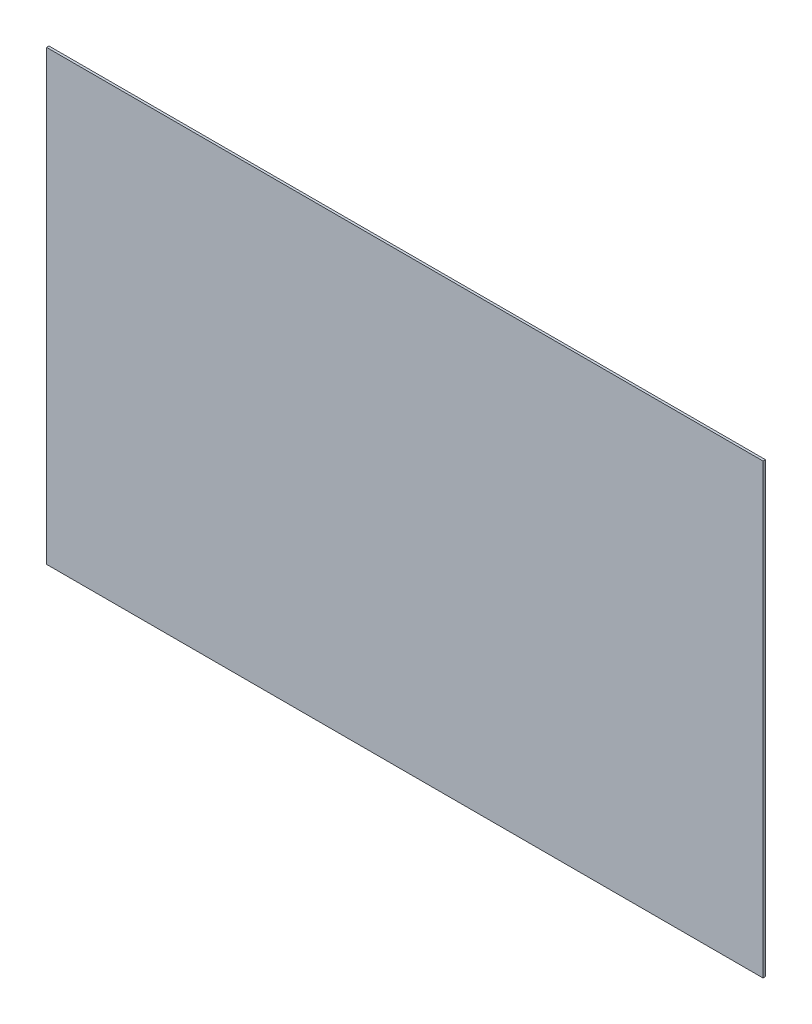
ISO-10303-21;
HEADER;
FILE_DESCRIPTION(('STEP AP214'),'2;1');
FILE_NAME('part.step','',(''),(''),'','','');
FILE_SCHEMA(('AUTOMOTIVE_DESIGN { 1 0 10303 214 1 1 1 1 }'));
ENDSEC;
DATA;
#1=APPLICATION_CONTEXT('core data for automotive mechanical design processes');
#2=APPLICATION_PROTOCOL_DEFINITION('international standard','automotive_design',2000,#1);
#3=PRODUCT_CONTEXT('',#1,'mechanical');
#4=PRODUCT('Part','Part','',(#3));
#5=PRODUCT_RELATED_PRODUCT_CATEGORY('part','',(#4));
#6=PRODUCT_DEFINITION_FORMATION('','',#4);
#7=PRODUCT_DEFINITION_CONTEXT('part definition',#1,'design');
#8=PRODUCT_DEFINITION('design','',#6,#7);
#9=PRODUCT_DEFINITION_SHAPE('','',#8);
#10=(LENGTH_UNIT() NAMED_UNIT(*) SI_UNIT(.MILLI.,.METRE.));
#11=(NAMED_UNIT(*) PLANE_ANGLE_UNIT() SI_UNIT($,.RADIAN.));
#12=(NAMED_UNIT(*) SI_UNIT($,.STERADIAN.) SOLID_ANGLE_UNIT());
#13=UNCERTAINTY_MEASURE_WITH_UNIT(LENGTH_MEASURE(1.E-05),#10,'distance_accuracy_value','');
#14=(GEOMETRIC_REPRESENTATION_CONTEXT(3) GLOBAL_UNCERTAINTY_ASSIGNED_CONTEXT((#13)) GLOBAL_UNIT_ASSIGNED_CONTEXT((#10,
#11,#12)) REPRESENTATION_CONTEXT('',''));
#15=CARTESIAN_POINT('',(0.,0.,0.));
#16=DIRECTION('',(0.,0.,1.));
#17=DIRECTION('',(1.,0.,0.));
#18=AXIS2_PLACEMENT_3D('',#15,#16,#17);
#19=CARTESIAN_POINT('',(0.,1200.00666664815,0.));
#20=DIRECTION('',(-1.,0.,0.));
#21=DIRECTION('',(0.,0.,1.));
#22=AXIS2_PLACEMENT_3D('',#19,#20,#21);
#23=PLANE('',#22);
#24=DIRECTION('',(0.,0.,-1.));
#25=VECTOR('',#24,1.);
#26=CARTESIAN_POINT('',(0.,0.,0.));
#27=LINE('',#26,#25);
#28=CARTESIAN_POINT('',(0.,0.,0.));
#29=VERTEX_POINT('',#28);
#30=CARTESIAN_POINT('',(0.,4.44089209850063E-13,-4.));
#31=VERTEX_POINT('',#30);
#32=EDGE_CURVE('E84',#29,#31,#27,.T.);
#33=ORIENTED_EDGE('',*,*,#32,.F.);
#34=DIRECTION('',(0.,-1.,0.));
#35=VECTOR('',#34,1.);
#36=CARTESIAN_POINT('',(0.,1200.00666664815,0.));
#37=LINE('',#36,#35);
#38=CARTESIAN_POINT('',(0.,-750.,0.));
#39=VERTEX_POINT('',#38);
#40=EDGE_CURVE('E38',#29,#39,#37,.T.);
#41=ORIENTED_EDGE('',*,*,#40,.T.);
#42=DIRECTION('',(0.,0.,-1.));
#43=VECTOR('',#42,1.);
#44=CARTESIAN_POINT('',(0.,-750.,0.));
#45=LINE('',#44,#43);
#46=CARTESIAN_POINT('',(0.,-750.,-4.));
#47=VERTEX_POINT('',#46);
#48=EDGE_CURVE('E82',#39,#47,#45,.T.);
#49=ORIENTED_EDGE('',*,*,#48,.T.);
#50=DIRECTION('',(0.,-1.,0.));
#51=VECTOR('',#50,1.);
#52=CARTESIAN_POINT('',(0.,1200.00666664815,-4.));
#53=LINE('',#52,#51);
#54=EDGE_CURVE('E73',#31,#47,#53,.T.);
#55=ORIENTED_EDGE('',*,*,#54,.F.);
#56=EDGE_LOOP('',(#33,#41,#49,#55));
#57=FACE_BOUND('',#56,.T.);
#58=ADVANCED_FACE('F34',(#57),#23,.F.);
#59=CARTESIAN_POINT('',(0.,1200.00666664815,-4.));
#60=DIRECTION('',(0.,0.,1.));
#61=DIRECTION('',(1.,0.,0.));
#62=AXIS2_PLACEMENT_3D('',#59,#60,#61);
#63=PLANE('',#62);
#64=DIRECTION('',(-1.,0.,0.));
#65=VECTOR('',#64,1.);
#66=CARTESIAN_POINT('',(0.,0.,-4.));
#67=LINE('',#66,#65);
#68=CARTESIAN_POINT('',(-1200.,4.44089209850063E-13,-4.));
#69=VERTEX_POINT('',#68);
#70=EDGE_CURVE('E43',#31,#69,#67,.T.);
#71=ORIENTED_EDGE('',*,*,#70,.F.);
#72=ORIENTED_EDGE('',*,*,#54,.T.);
#73=DIRECTION('',(-1.,0.,0.));
#74=VECTOR('',#73,1.);
#75=CARTESIAN_POINT('',(0.,-750.,-4.));
#76=LINE('',#75,#74);
#77=CARTESIAN_POINT('',(-1200.,-750.,-4.));
#78=VERTEX_POINT('',#77);
#79=EDGE_CURVE('E94',#47,#78,#76,.T.);
#80=ORIENTED_EDGE('',*,*,#79,.T.);
#81=DIRECTION('',(0.,-1.,0.));
#82=VECTOR('',#81,1.);
#83=CARTESIAN_POINT('',(-1200.,1200.00666664815,-4.));
#84=LINE('',#83,#82);
#85=EDGE_CURVE('E103',#69,#78,#84,.T.);
#86=ORIENTED_EDGE('',*,*,#85,.F.);
#87=EDGE_LOOP('',(#71,#72,#80,#86));
#88=FACE_BOUND('',#87,.T.);
#89=ADVANCED_FACE('F107',(#88),#63,.F.);
#90=CARTESIAN_POINT('',(-1200.,1200.00666664815,0.));
#91=DIRECTION('',(1.,0.,0.));
#92=DIRECTION('',(0.,0.,-1.));
#93=AXIS2_PLACEMENT_3D('',#90,#91,#92);
#94=PLANE('',#93);
#95=DIRECTION('',(0.,0.,1.));
#96=VECTOR('',#95,1.);
#97=CARTESIAN_POINT('',(-1200.,0.,0.));
#98=LINE('',#97,#96);
#99=CARTESIAN_POINT('',(-1200.,4.44089209850063E-13,0.));
#100=VERTEX_POINT('',#99);
#101=EDGE_CURVE('E11',#69,#100,#98,.T.);
#102=ORIENTED_EDGE('',*,*,#101,.F.);
#103=ORIENTED_EDGE('',*,*,#85,.T.);
#104=DIRECTION('',(0.,0.,1.));
#105=VECTOR('',#104,1.);
#106=CARTESIAN_POINT('',(-1200.,-750.,0.));
#107=LINE('',#106,#105);
#108=CARTESIAN_POINT('',(-1200.,-750.,0.));
#109=VERTEX_POINT('',#108);
#110=EDGE_CURVE('E104',#78,#109,#107,.T.);
#111=ORIENTED_EDGE('',*,*,#110,.T.);
#112=DIRECTION('',(0.,-1.,0.));
#113=VECTOR('',#112,1.);
#114=CARTESIAN_POINT('',(-1200.,1200.00666664815,0.));
#115=LINE('',#114,#113);
#116=EDGE_CURVE('E56',#100,#109,#115,.T.);
#117=ORIENTED_EDGE('',*,*,#116,.F.);
#118=EDGE_LOOP('',(#102,#103,#111,#117));
#119=FACE_BOUND('',#118,.T.);
#120=ADVANCED_FACE('F106',(#119),#94,.F.);
#121=CARTESIAN_POINT('',(0.,1200.00666664815,0.));
#122=DIRECTION('',(0.,0.,-1.));
#123=DIRECTION('',(-1.,0.,0.));
#124=AXIS2_PLACEMENT_3D('',#121,#122,#123);
#125=PLANE('',#124);
#126=DIRECTION('',(1.,0.,0.));
#127=VECTOR('',#126,1.);
#128=CARTESIAN_POINT('',(0.,0.,0.));
#129=LINE('',#128,#127);
#130=EDGE_CURVE('E91',#100,#29,#129,.T.);
#131=ORIENTED_EDGE('',*,*,#130,.F.);
#132=ORIENTED_EDGE('',*,*,#116,.T.);
#133=DIRECTION('',(1.,0.,0.));
#134=VECTOR('',#133,1.);
#135=CARTESIAN_POINT('',(0.,-750.,0.));
#136=LINE('',#135,#134);
#137=EDGE_CURVE('E87',#109,#39,#136,.T.);
#138=ORIENTED_EDGE('',*,*,#137,.T.);
#139=ORIENTED_EDGE('',*,*,#40,.F.);
#140=EDGE_LOOP('',(#131,#132,#138,#139));
#141=FACE_BOUND('',#140,.T.);
#142=ADVANCED_FACE('F88',(#141),#125,.F.);
#143=CARTESIAN_POINT('',(0.,-750.,-4.));
#144=DIRECTION('',(0.,1.,0.));
#145=DIRECTION('',(0.,0.,1.));
#146=AXIS2_PLACEMENT_3D('',#143,#144,#145);
#147=PLANE('',#146);
#148=ORIENTED_EDGE('',*,*,#48,.F.);
#149=ORIENTED_EDGE('',*,*,#137,.F.);
#150=ORIENTED_EDGE('',*,*,#110,.F.);
#151=ORIENTED_EDGE('',*,*,#79,.F.);
#152=EDGE_LOOP('',(#148,#149,#150,#151));
#153=FACE_BOUND('',#152,.T.);
#154=ADVANCED_FACE('F93',(#153),#147,.F.);
#155=CARTESIAN_POINT('',(0.,0.,0.));
#156=DIRECTION('',(0.,1.,0.));
#157=DIRECTION('',(0.,0.,1.));
#158=AXIS2_PLACEMENT_3D('',#155,#156,#157);
#159=PLANE('',#158);
#160=ORIENTED_EDGE('',*,*,#130,.T.);
#161=ORIENTED_EDGE('',*,*,#32,.T.);
#162=ORIENTED_EDGE('',*,*,#70,.T.);
#163=ORIENTED_EDGE('',*,*,#101,.T.);
#164=EDGE_LOOP('',(#160,#161,#162,#163));
#165=FACE_BOUND('',#164,.T.);
#166=ADVANCED_FACE('F36',(#165),#159,.T.);
#167=CLOSED_SHELL('',(#58,#89,#120,#142,#154,#166));
#168=MANIFOLD_SOLID_BREP('B2',#167);
#169=ADVANCED_BREP_SHAPE_REPRESENTATION('',(#18,#168),#14);
#170=SHAPE_DEFINITION_REPRESENTATION(#9,#169);
ENDSEC;
END-ISO-10303-21;
